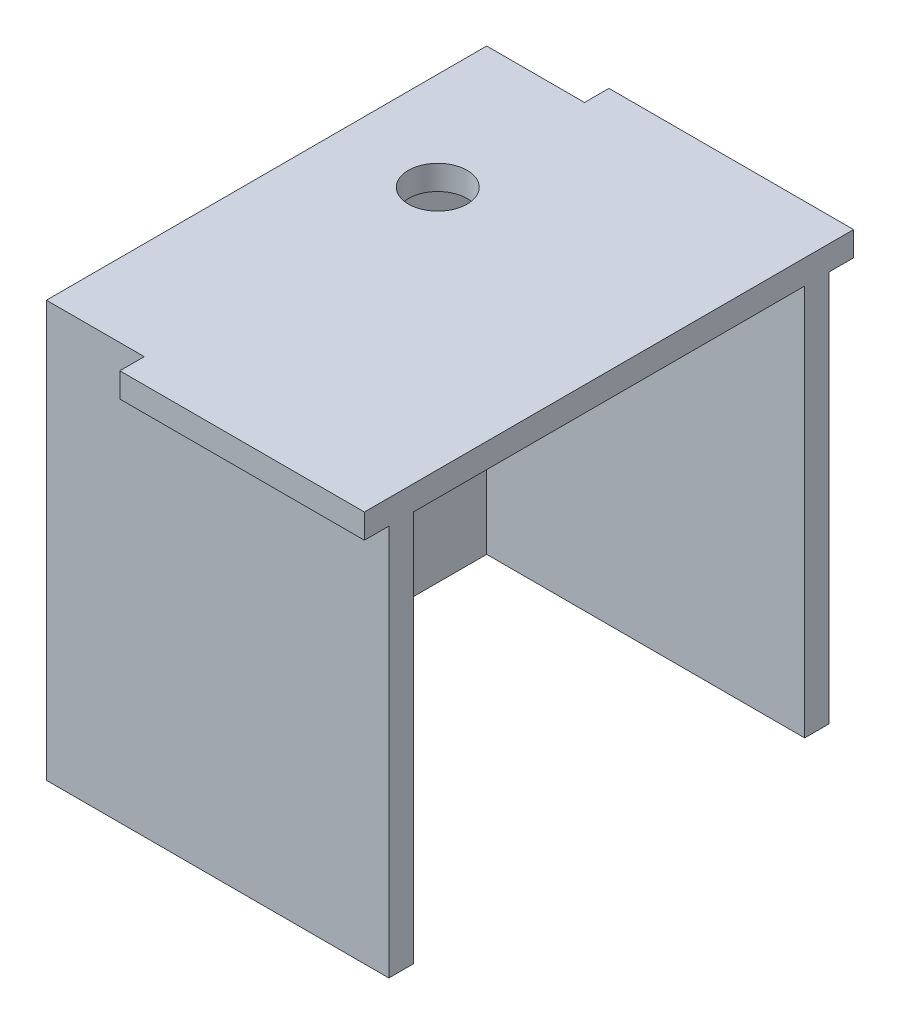
ISO-10303-21;
HEADER;
FILE_DESCRIPTION(('STEP AP214'),'2;1');
FILE_NAME('part.step','',(''),(''),'','','');
FILE_SCHEMA(('AUTOMOTIVE_DESIGN { 1 0 10303 214 1 1 1 1 }'));
ENDSEC;
DATA;
#1=APPLICATION_CONTEXT('core data for automotive mechanical design processes');
#2=APPLICATION_PROTOCOL_DEFINITION('international standard','automotive_design',2000,#1);
#3=PRODUCT_CONTEXT('',#1,'mechanical');
#4=PRODUCT('Part','Part','',(#3));
#5=PRODUCT_RELATED_PRODUCT_CATEGORY('part','',(#4));
#6=PRODUCT_DEFINITION_FORMATION('','',#4);
#7=PRODUCT_DEFINITION_CONTEXT('part definition',#1,'design');
#8=PRODUCT_DEFINITION('design','',#6,#7);
#9=PRODUCT_DEFINITION_SHAPE('','',#8);
#10=(LENGTH_UNIT() NAMED_UNIT(*) SI_UNIT(.MILLI.,.METRE.));
#11=(NAMED_UNIT(*) PLANE_ANGLE_UNIT() SI_UNIT($,.RADIAN.));
#12=(NAMED_UNIT(*) SI_UNIT($,.STERADIAN.) SOLID_ANGLE_UNIT());
#13=UNCERTAINTY_MEASURE_WITH_UNIT(LENGTH_MEASURE(1.E-05),#10,'distance_accuracy_value','');
#14=(GEOMETRIC_REPRESENTATION_CONTEXT(3) GLOBAL_UNCERTAINTY_ASSIGNED_CONTEXT((#13)) GLOBAL_UNIT_ASSIGNED_CONTEXT((#10,
#11,#12)) REPRESENTATION_CONTEXT('',''));
#15=CARTESIAN_POINT('',(0.,0.,0.));
#16=DIRECTION('',(0.,0.,1.));
#17=DIRECTION('',(1.,0.,0.));
#18=AXIS2_PLACEMENT_3D('',#15,#16,#17);
#19=CARTESIAN_POINT('',(-65.,0.,100.));
#20=DIRECTION('',(-1.,0.,0.));
#21=DIRECTION('',(0.,-1.,0.));
#22=AXIS2_PLACEMENT_3D('',#19,#20,#21);
#23=PLANE('',#22);
#24=CARTESIAN_POINT('',(-65.,-10.,50.));
#25=DIRECTION('',(1.,0.,0.));
#26=DIRECTION('',(0.,0.,-1.));
#27=AXIS2_PLACEMENT_3D('',#24,#25,#26);
#28=CIRCLE('',#27,1.5);
#29=CARTESIAN_POINT('',(-65.,-10.,48.5));
#30=VERTEX_POINT('',#29);
#31=EDGE_CURVE('E216',#30,#30,#28,.T.);
#32=ORIENTED_EDGE('',*,*,#31,.F.);
#33=EDGE_LOOP('',(#32));
#34=FACE_BOUND('',#33,.T.);
#35=CARTESIAN_POINT('',(-65.,-60.45,50.));
#36=DIRECTION('',(1.,0.,0.));
#37=DIRECTION('',(0.,0.,-1.));
#38=AXIS2_PLACEMENT_3D('',#35,#36,#37);
#39=CIRCLE('',#38,1.5);
#40=CARTESIAN_POINT('',(-65.,-60.45,48.5));
#41=VERTEX_POINT('',#40);
#42=EDGE_CURVE('E322',#41,#41,#39,.T.);
#43=ORIENTED_EDGE('',*,*,#42,.F.);
#44=EDGE_LOOP('',(#43));
#45=FACE_BOUND('',#44,.T.);
#46=DIRECTION('',(0.,1.,0.));
#47=VECTOR('',#46,1.);
#48=CARTESIAN_POINT('',(-65.,-56.275,75.));
#49=LINE('',#48,#47);
#50=CARTESIAN_POINT('',(-65.,-56.275,75.));
#51=VERTEX_POINT('',#50);
#52=CARTESIAN_POINT('',(-65.,-14.175,75.));
#53=VERTEX_POINT('',#52);
#54=EDGE_CURVE('E299',#51,#53,#49,.T.);
#55=ORIENTED_EDGE('',*,*,#54,.T.);
#56=DIRECTION('',(0.,0.,1.));
#57=VECTOR('',#56,1.);
#58=CARTESIAN_POINT('',(-65.,-14.175,95.));
#59=LINE('',#58,#57);
#60=CARTESIAN_POINT('',(-65.,-14.175,28.95));
#61=VERTEX_POINT('',#60);
#62=EDGE_CURVE('E311',#61,#53,#59,.T.);
#63=ORIENTED_EDGE('',*,*,#62,.F.);
#64=DIRECTION('',(0.,1.,0.));
#65=VECTOR('',#64,1.);
#66=CARTESIAN_POINT('',(-65.,-14.175,28.95));
#67=LINE('',#66,#65);
#68=CARTESIAN_POINT('',(-65.,-56.275,28.95));
#69=VERTEX_POINT('',#68);
#70=EDGE_CURVE('E308',#69,#61,#67,.T.);
#71=ORIENTED_EDGE('',*,*,#70,.F.);
#72=DIRECTION('',(0.,0.,-1.));
#73=VECTOR('',#72,1.);
#74=CARTESIAN_POINT('',(-65.,-56.275,95.));
#75=LINE('',#74,#73);
#76=EDGE_CURVE('E306',#51,#69,#75,.T.);
#77=ORIENTED_EDGE('',*,*,#76,.F.);
#78=EDGE_LOOP('',(#55,#63,#71,#77));
#79=FACE_BOUND('',#78,.T.);
#80=DIRECTION('',(0.,-1.,0.));
#81=VECTOR('',#80,1.);
#82=CARTESIAN_POINT('',(-65.,-80.,10.));
#83=LINE('',#82,#81);
#84=CARTESIAN_POINT('',(-65.,0.,9.99999999999999));
#85=VERTEX_POINT('',#84);
#86=CARTESIAN_POINT('',(-65.,-80.,10.));
#87=VERTEX_POINT('',#86);
#88=EDGE_CURVE('E168',#85,#87,#83,.T.);
#89=ORIENTED_EDGE('',*,*,#88,.F.);
#90=DIRECTION('',(0.,0.,-1.));
#91=VECTOR('',#90,1.);
#92=CARTESIAN_POINT('',(-65.,0.,100.));
#93=LINE('',#92,#91);
#94=CARTESIAN_POINT('',(-65.,0.,90.));
#95=VERTEX_POINT('',#94);
#96=EDGE_CURVE('E195',#95,#85,#93,.T.);
#97=ORIENTED_EDGE('',*,*,#96,.F.);
#98=DIRECTION('',(0.,1.,0.));
#99=VECTOR('',#98,1.);
#100=CARTESIAN_POINT('',(-65.,-80.,90.));
#101=LINE('',#100,#99);
#102=CARTESIAN_POINT('',(-65.,-80.,90.));
#103=VERTEX_POINT('',#102);
#104=EDGE_CURVE('E178',#103,#95,#101,.T.);
#105=ORIENTED_EDGE('',*,*,#104,.F.);
#106=DIRECTION('',(0.,0.,-1.));
#107=VECTOR('',#106,1.);
#108=CARTESIAN_POINT('',(-65.,-80.,100.));
#109=LINE('',#108,#107);
#110=EDGE_CURVE('E200',#103,#87,#109,.T.);
#111=ORIENTED_EDGE('',*,*,#110,.T.);
#112=EDGE_LOOP('',(#89,#97,#105,#111));
#113=FACE_BOUND('',#112,.T.);
#114=ADVANCED_FACE('F33',(#34,#45,#79,#113),#23,.F.);
#115=CARTESIAN_POINT('',(0.,0.,100.));
#116=DIRECTION('',(0.,1.,0.));
#117=DIRECTION('',(-1.,0.,0.));
#118=AXIS2_PLACEMENT_3D('',#115,#116,#117);
#119=PLANE('',#118);
#120=DIRECTION('',(-1.,0.,0.));
#121=VECTOR('',#120,1.);
#122=CARTESIAN_POINT('',(0.,0.,5.));
#123=LINE('',#122,#121);
#124=CARTESIAN_POINT('',(0.,0.,5.));
#125=VERTEX_POINT('',#124);
#126=CARTESIAN_POINT('',(-50.,0.,5.));
#127=VERTEX_POINT('',#126);
#128=EDGE_CURVE('E171',#125,#127,#123,.T.);
#129=ORIENTED_EDGE('',*,*,#128,.T.);
#130=DIRECTION('',(0.,0.,-1.));
#131=VECTOR('',#130,1.);
#132=CARTESIAN_POINT('',(-50.,0.,5.));
#133=LINE('',#132,#131);
#134=CARTESIAN_POINT('',(-50.,0.,0.));
#135=VERTEX_POINT('',#134);
#136=EDGE_CURVE('E228',#127,#135,#133,.T.);
#137=ORIENTED_EDGE('',*,*,#136,.T.);
#138=DIRECTION('',(1.,0.,0.));
#139=VECTOR('',#138,1.);
#140=CARTESIAN_POINT('',(0.,0.,0.));
#141=LINE('',#140,#139);
#142=CARTESIAN_POINT('',(0.,0.,0.));
#143=VERTEX_POINT('',#142);
#144=EDGE_CURVE('E183',#135,#143,#141,.T.);
#145=ORIENTED_EDGE('',*,*,#144,.T.);
#146=DIRECTION('',(0.,0.,-1.));
#147=VECTOR('',#146,1.);
#148=CARTESIAN_POINT('',(0.,0.,100.));
#149=LINE('',#148,#147);
#150=EDGE_CURVE('E162',#125,#143,#149,.T.);
#151=ORIENTED_EDGE('',*,*,#150,.F.);
#152=EDGE_LOOP('',(#129,#137,#145,#151));
#153=FACE_BOUND('',#152,.T.);
#154=ADVANCED_FACE('F181',(#153),#119,.F.);
#155=CARTESIAN_POINT('',(-50.,0.,35.));
#156=DIRECTION('',(0.,1.,0.));
#157=DIRECTION('',(-1.,0.,0.));
#158=AXIS2_PLACEMENT_3D('',#155,#156,#157);
#159=CIRCLE('',#158,6.);
#160=CARTESIAN_POINT('',(-56.,0.,35.));
#161=VERTEX_POINT('',#160);
#162=EDGE_CURVE('E293',#161,#161,#159,.T.);
#163=ORIENTED_EDGE('',*,*,#162,.T.);
#164=EDGE_LOOP('',(#163));
#165=FACE_BOUND('',#164,.T.);
#166=DIRECTION('',(-1.,0.,0.));
#167=VECTOR('',#166,1.);
#168=CARTESIAN_POINT('',(0.,0.,9.99999999999999));
#169=LINE('',#168,#167);
#170=CARTESIAN_POINT('',(0.,0.,9.99999999999999));
#171=VERTEX_POINT('',#170);
#172=EDGE_CURVE('E179',#171,#85,#169,.T.);
#173=ORIENTED_EDGE('',*,*,#172,.F.);
#174=CARTESIAN_POINT('',(0.,0.,90.));
#175=VERTEX_POINT('',#174);
#176=EDGE_CURVE('E185',#175,#171,#149,.T.);
#177=ORIENTED_EDGE('',*,*,#176,.F.);
#178=DIRECTION('',(-1.,0.,0.));
#179=VECTOR('',#178,1.);
#180=CARTESIAN_POINT('',(0.,0.,90.));
#181=LINE('',#180,#179);
#182=EDGE_CURVE('E280',#175,#95,#181,.T.);
#183=ORIENTED_EDGE('',*,*,#182,.T.);
#184=ORIENTED_EDGE('',*,*,#96,.T.);
#185=EDGE_LOOP('',(#173,#177,#183,#184));
#186=FACE_BOUND('',#185,.T.);
#187=ADVANCED_FACE('F363',(#165,#186),#119,.F.);
#188=DIRECTION('',(-1.,0.,0.));
#189=VECTOR('',#188,1.);
#190=CARTESIAN_POINT('',(0.,0.,95.));
#191=LINE('',#190,#189);
#192=CARTESIAN_POINT('',(0.,0.,95.));
#193=VERTEX_POINT('',#192);
#194=CARTESIAN_POINT('',(-50.,0.,95.));
#195=VERTEX_POINT('',#194);
#196=EDGE_CURVE('E277',#193,#195,#191,.T.);
#197=ORIENTED_EDGE('',*,*,#196,.F.);
#198=CARTESIAN_POINT('',(0.,0.,100.));
#199=VERTEX_POINT('',#198);
#200=EDGE_CURVE('E188',#199,#193,#149,.T.);
#201=ORIENTED_EDGE('',*,*,#200,.F.);
#202=DIRECTION('',(1.,0.,0.));
#203=VECTOR('',#202,1.);
#204=CARTESIAN_POINT('',(0.,0.,100.));
#205=LINE('',#204,#203);
#206=CARTESIAN_POINT('',(-50.,0.,100.));
#207=VERTEX_POINT('',#206);
#208=EDGE_CURVE('E186',#207,#199,#205,.T.);
#209=ORIENTED_EDGE('',*,*,#208,.F.);
#210=DIRECTION('',(0.,0.,1.));
#211=VECTOR('',#210,1.);
#212=CARTESIAN_POINT('',(-50.,0.,95.));
#213=LINE('',#212,#211);
#214=EDGE_CURVE('E239',#195,#207,#213,.T.);
#215=ORIENTED_EDGE('',*,*,#214,.F.);
#216=EDGE_LOOP('',(#197,#201,#209,#215));
#217=FACE_BOUND('',#216,.T.);
#218=ADVANCED_FACE('F276',(#217),#119,.F.);
#219=CARTESIAN_POINT('',(0.,5.,100.));
#220=DIRECTION('',(0.,-1.,0.));
#221=DIRECTION('',(1.,0.,0.));
#222=AXIS2_PLACEMENT_3D('',#219,#220,#221);
#223=PLANE('',#222);
#224=CARTESIAN_POINT('',(-50.,5.,35.));
#225=DIRECTION('',(0.,1.,0.));
#226=DIRECTION('',(-1.,0.,0.));
#227=AXIS2_PLACEMENT_3D('',#224,#225,#226);
#228=CIRCLE('',#227,6.);
#229=CARTESIAN_POINT('',(-56.,5.,35.));
#230=VERTEX_POINT('',#229);
#231=EDGE_CURVE('E292',#230,#230,#228,.T.);
#232=ORIENTED_EDGE('',*,*,#231,.F.);
#233=EDGE_LOOP('',(#232));
#234=FACE_BOUND('',#233,.T.);
#235=DIRECTION('',(1.,0.,0.));
#236=VECTOR('',#235,1.);
#237=CARTESIAN_POINT('',(-65.,4.99999999999999,5.));
#238=LINE('',#237,#236);
#239=CARTESIAN_POINT('',(-70.,4.99999999999998,5.));
#240=VERTEX_POINT('',#239);
#241=CARTESIAN_POINT('',(-50.,4.99999999999999,5.));
#242=VERTEX_POINT('',#241);
#243=EDGE_CURVE('E221',#240,#242,#238,.T.);
#244=ORIENTED_EDGE('',*,*,#243,.F.);
#245=DIRECTION('',(0.,0.,1.));
#246=VECTOR('',#245,1.);
#247=CARTESIAN_POINT('',(-70.,4.99999999999998,0.));
#248=LINE('',#247,#246);
#249=CARTESIAN_POINT('',(-70.,4.99999999999998,95.));
#250=VERTEX_POINT('',#249);
#251=EDGE_CURVE('E290',#240,#250,#248,.T.);
#252=ORIENTED_EDGE('',*,*,#251,.T.);
#253=DIRECTION('',(-1.,0.,0.));
#254=VECTOR('',#253,1.);
#255=CARTESIAN_POINT('',(-65.,4.99999999999999,95.));
#256=LINE('',#255,#254);
#257=CARTESIAN_POINT('',(-50.,4.99999999999999,95.));
#258=VERTEX_POINT('',#257);
#259=EDGE_CURVE('E236',#258,#250,#256,.T.);
#260=ORIENTED_EDGE('',*,*,#259,.F.);
#261=DIRECTION('',(0.,0.,1.));
#262=VECTOR('',#261,1.);
#263=CARTESIAN_POINT('',(-50.,4.99999999999999,95.));
#264=LINE('',#263,#262);
#265=CARTESIAN_POINT('',(-50.,4.99999999999999,100.));
#266=VERTEX_POINT('',#265);
#267=EDGE_CURVE('E241',#258,#266,#264,.T.);
#268=ORIENTED_EDGE('',*,*,#267,.T.);
#269=DIRECTION('',(-1.,0.,0.));
#270=VECTOR('',#269,1.);
#271=CARTESIAN_POINT('',(0.,5.,100.));
#272=LINE('',#271,#270);
#273=CARTESIAN_POINT('',(0.,5.,100.));
#274=VERTEX_POINT('',#273);
#275=EDGE_CURVE('E190',#274,#266,#272,.T.);
#276=ORIENTED_EDGE('',*,*,#275,.F.);
#277=DIRECTION('',(0.,0.,-1.));
#278=VECTOR('',#277,1.);
#279=CARTESIAN_POINT('',(0.,5.,100.));
#280=LINE('',#279,#278);
#281=CARTESIAN_POINT('',(0.,5.,0.));
#282=VERTEX_POINT('',#281);
#283=EDGE_CURVE('E41',#274,#282,#280,.T.);
#284=ORIENTED_EDGE('',*,*,#283,.T.);
#285=DIRECTION('',(-1.,0.,0.));
#286=VECTOR('',#285,1.);
#287=CARTESIAN_POINT('',(0.,5.,0.));
#288=LINE('',#287,#286);
#289=CARTESIAN_POINT('',(-50.,4.99999999999999,0.));
#290=VERTEX_POINT('',#289);
#291=EDGE_CURVE('E260',#282,#290,#288,.T.);
#292=ORIENTED_EDGE('',*,*,#291,.T.);
#293=DIRECTION('',(0.,0.,-1.));
#294=VECTOR('',#293,1.);
#295=CARTESIAN_POINT('',(-50.,4.99999999999999,5.));
#296=LINE('',#295,#294);
#297=EDGE_CURVE('E231',#242,#290,#296,.T.);
#298=ORIENTED_EDGE('',*,*,#297,.F.);
#299=EDGE_LOOP('',(#244,#252,#260,#268,#276,#284,#292,#298));
#300=FACE_BOUND('',#299,.T.);
#301=ADVANCED_FACE('F265',(#234,#300),#223,.F.);
#302=CARTESIAN_POINT('',(-70.,0.,100.));
#303=DIRECTION('',(1.,0.,0.));
#304=DIRECTION('',(0.,1.,0.));
#305=AXIS2_PLACEMENT_3D('',#302,#303,#304);
#306=PLANE('',#305);
#307=DIRECTION('',(0.,0.,1.));
#308=VECTOR('',#307,1.);
#309=CARTESIAN_POINT('',(-70.,-14.175,100.));
#310=LINE('',#309,#308);
#311=CARTESIAN_POINT('',(-70.,-14.175,28.95));
#312=VERTEX_POINT('',#311);
#313=CARTESIAN_POINT('',(-70.,-14.175,75.));
#314=VERTEX_POINT('',#313);
#315=EDGE_CURVE('E320',#312,#314,#310,.T.);
#316=ORIENTED_EDGE('',*,*,#315,.T.);
#317=DIRECTION('',(0.,1.,0.));
#318=VECTOR('',#317,1.);
#319=CARTESIAN_POINT('',(-70.,-56.275,75.));
#320=LINE('',#319,#318);
#321=CARTESIAN_POINT('',(-70.,-56.275,75.));
#322=VERTEX_POINT('',#321);
#323=EDGE_CURVE('E303',#322,#314,#320,.T.);
#324=ORIENTED_EDGE('',*,*,#323,.F.);
#325=DIRECTION('',(0.,0.,-1.));
#326=VECTOR('',#325,1.);
#327=CARTESIAN_POINT('',(-70.,-56.275,100.));
#328=LINE('',#327,#326);
#329=CARTESIAN_POINT('',(-70.,-56.275,28.95));
#330=VERTEX_POINT('',#329);
#331=EDGE_CURVE('E316',#322,#330,#328,.T.);
#332=ORIENTED_EDGE('',*,*,#331,.T.);
#333=DIRECTION('',(0.,1.,0.));
#334=VECTOR('',#333,1.);
#335=CARTESIAN_POINT('',(-70.,0.,28.95));
#336=LINE('',#335,#334);
#337=EDGE_CURVE('E11',#330,#312,#336,.T.);
#338=ORIENTED_EDGE('',*,*,#337,.T.);
#339=EDGE_LOOP('',(#316,#324,#332,#338));
#340=FACE_BOUND('',#339,.T.);
#341=CARTESIAN_POINT('',(-70.,-10.,50.));
#342=DIRECTION('',(1.,0.,0.));
#343=DIRECTION('',(0.,1.,0.));
#344=AXIS2_PLACEMENT_3D('',#341,#342,#343);
#345=CIRCLE('',#344,1.5);
#346=CARTESIAN_POINT('',(-70.,-8.50000000000001,50.));
#347=VERTEX_POINT('',#346);
#348=EDGE_CURVE('E215',#347,#347,#345,.T.);
#349=ORIENTED_EDGE('',*,*,#348,.T.);
#350=EDGE_LOOP('',(#349));
#351=FACE_BOUND('',#350,.T.);
#352=CARTESIAN_POINT('',(-70.,-60.45,50.));
#353=DIRECTION('',(1.,0.,0.));
#354=DIRECTION('',(0.,1.,0.));
#355=AXIS2_PLACEMENT_3D('',#352,#353,#354);
#356=CIRCLE('',#355,1.5);
#357=CARTESIAN_POINT('',(-70.,-58.95,50.));
#358=VERTEX_POINT('',#357);
#359=EDGE_CURVE('E213',#358,#358,#356,.T.);
#360=ORIENTED_EDGE('',*,*,#359,.T.);
#361=EDGE_LOOP('',(#360));
#362=FACE_BOUND('',#361,.T.);
#363=ORIENTED_EDGE('',*,*,#251,.F.);
#364=DIRECTION('',(0.,1.,0.));
#365=VECTOR('',#364,1.);
#366=CARTESIAN_POINT('',(-70.,0.,5.));
#367=LINE('',#366,#365);
#368=CARTESIAN_POINT('',(-70.,-80.,5.));
#369=VERTEX_POINT('',#368);
#370=EDGE_CURVE('E247',#369,#240,#367,.T.);
#371=ORIENTED_EDGE('',*,*,#370,.F.);
#372=DIRECTION('',(0.,0.,-1.));
#373=VECTOR('',#372,1.);
#374=CARTESIAN_POINT('',(-70.,-80.,100.));
#375=LINE('',#374,#373);
#376=CARTESIAN_POINT('',(-70.,-80.,95.));
#377=VERTEX_POINT('',#376);
#378=EDGE_CURVE('E206',#377,#369,#375,.T.);
#379=ORIENTED_EDGE('',*,*,#378,.F.);
#380=DIRECTION('',(0.,-1.,0.));
#381=VECTOR('',#380,1.);
#382=CARTESIAN_POINT('',(-70.,0.,95.));
#383=LINE('',#382,#381);
#384=EDGE_CURVE('E249',#250,#377,#383,.T.);
#385=ORIENTED_EDGE('',*,*,#384,.F.);
#386=EDGE_LOOP('',(#363,#371,#379,#385));
#387=FACE_BOUND('',#386,.T.);
#388=ADVANCED_FACE('F369',(#340,#351,#362,#387),#306,.F.);
#389=CARTESIAN_POINT('',(-75.,-14.175,95.));
#390=DIRECTION('',(0.,1.,0.));
#391=DIRECTION('',(0.,0.,1.));
#392=AXIS2_PLACEMENT_3D('',#389,#390,#391);
#393=PLANE('',#392);
#394=DIRECTION('',(1.,0.,0.));
#395=VECTOR('',#394,1.);
#396=CARTESIAN_POINT('',(-65.,-14.175,75.));
#397=LINE('',#396,#395);
#398=EDGE_CURVE('E48',#314,#53,#397,.T.);
#399=ORIENTED_EDGE('',*,*,#398,.F.);
#400=ORIENTED_EDGE('',*,*,#315,.F.);
#401=DIRECTION('',(1.,0.,0.));
#402=VECTOR('',#401,1.);
#403=CARTESIAN_POINT('',(-75.,-14.175,28.95));
#404=LINE('',#403,#402);
#405=EDGE_CURVE('E314',#312,#61,#404,.T.);
#406=ORIENTED_EDGE('',*,*,#405,.T.);
#407=ORIENTED_EDGE('',*,*,#62,.T.);
#408=EDGE_LOOP('',(#399,#400,#406,#407));
#409=FACE_BOUND('',#408,.T.);
#410=ADVANCED_FACE('F399',(#409),#393,.F.);
#411=CARTESIAN_POINT('',(-75.,-56.275,95.));
#412=DIRECTION('',(0.,-1.,0.));
#413=DIRECTION('',(0.,0.,-1.));
#414=AXIS2_PLACEMENT_3D('',#411,#412,#413);
#415=PLANE('',#414);
#416=DIRECTION('',(1.,0.,0.));
#417=VECTOR('',#416,1.);
#418=CARTESIAN_POINT('',(-65.,-56.275,75.));
#419=LINE('',#418,#417);
#420=EDGE_CURVE('E56',#322,#51,#419,.T.);
#421=ORIENTED_EDGE('',*,*,#420,.T.);
#422=ORIENTED_EDGE('',*,*,#76,.T.);
#423=DIRECTION('',(1.,0.,0.));
#424=VECTOR('',#423,1.);
#425=CARTESIAN_POINT('',(-75.,-56.275,28.95));
#426=LINE('',#425,#424);
#427=EDGE_CURVE('E313',#330,#69,#426,.T.);
#428=ORIENTED_EDGE('',*,*,#427,.F.);
#429=ORIENTED_EDGE('',*,*,#331,.F.);
#430=EDGE_LOOP('',(#421,#422,#428,#429));
#431=FACE_BOUND('',#430,.T.);
#432=ADVANCED_FACE('F397',(#431),#415,.F.);
#433=CARTESIAN_POINT('',(-65.,-80.,100.));
#434=DIRECTION('',(0.,1.,0.));
#435=DIRECTION('',(0.,0.,1.));
#436=AXIS2_PLACEMENT_3D('',#433,#434,#435);
#437=PLANE('',#436);
#438=DIRECTION('',(-1.,0.,0.));
#439=VECTOR('',#438,1.);
#440=CARTESIAN_POINT('',(-65.,-80.,5.));
#441=LINE('',#440,#439);
#442=CARTESIAN_POINT('',(0.,-80.,5.));
#443=VERTEX_POINT('',#442);
#444=EDGE_CURVE('E244',#443,#369,#441,.T.);
#445=ORIENTED_EDGE('',*,*,#444,.F.);
#446=DIRECTION('',(0.,0.,-1.));
#447=VECTOR('',#446,1.);
#448=CARTESIAN_POINT('',(0.,-80.,5.));
#449=LINE('',#448,#447);
#450=CARTESIAN_POINT('',(0.,-80.,10.));
#451=VERTEX_POINT('',#450);
#452=EDGE_CURVE('E165',#451,#443,#449,.T.);
#453=ORIENTED_EDGE('',*,*,#452,.F.);
#454=DIRECTION('',(-1.,0.,0.));
#455=VECTOR('',#454,1.);
#456=CARTESIAN_POINT('',(0.,-80.,10.));
#457=LINE('',#456,#455);
#458=EDGE_CURVE('E348',#451,#87,#457,.T.);
#459=ORIENTED_EDGE('',*,*,#458,.T.);
#460=ORIENTED_EDGE('',*,*,#110,.F.);
#461=DIRECTION('',(-1.,0.,0.));
#462=VECTOR('',#461,1.);
#463=CARTESIAN_POINT('',(0.,-80.,90.));
#464=LINE('',#463,#462);
#465=CARTESIAN_POINT('',(0.,-80.,90.));
#466=VERTEX_POINT('',#465);
#467=EDGE_CURVE('E283',#466,#103,#464,.T.);
#468=ORIENTED_EDGE('',*,*,#467,.F.);
#469=DIRECTION('',(0.,0.,-1.));
#470=VECTOR('',#469,1.);
#471=CARTESIAN_POINT('',(0.,-80.,95.));
#472=LINE('',#471,#470);
#473=CARTESIAN_POINT('',(0.,-80.,95.));
#474=VERTEX_POINT('',#473);
#475=EDGE_CURVE('E285',#474,#466,#472,.T.);
#476=ORIENTED_EDGE('',*,*,#475,.F.);
#477=DIRECTION('',(1.,0.,0.));
#478=VECTOR('',#477,1.);
#479=CARTESIAN_POINT('',(-65.,-80.,95.));
#480=LINE('',#479,#478);
#481=EDGE_CURVE('E251',#377,#474,#480,.T.);
#482=ORIENTED_EDGE('',*,*,#481,.F.);
#483=ORIENTED_EDGE('',*,*,#378,.T.);
#484=EDGE_LOOP('',(#445,#453,#459,#460,#468,#476,#482,#483));
#485=FACE_BOUND('',#484,.T.);
#486=ADVANCED_FACE('F359',(#485),#437,.F.);
#487=CARTESIAN_POINT('',(0.,0.,100.));
#488=DIRECTION('',(-1.,0.,0.));
#489=DIRECTION('',(0.,0.,1.));
#490=AXIS2_PLACEMENT_3D('',#487,#488,#489);
#491=PLANE('',#490);
#492=DIRECTION('',(0.,1.,0.));
#493=VECTOR('',#492,1.);
#494=CARTESIAN_POINT('',(0.,0.,0.));
#495=LINE('',#494,#493);
#496=EDGE_CURVE('E253',#143,#282,#495,.T.);
#497=ORIENTED_EDGE('',*,*,#496,.T.);
#498=ORIENTED_EDGE('',*,*,#283,.F.);
#499=DIRECTION('',(0.,1.,0.));
#500=VECTOR('',#499,1.);
#501=CARTESIAN_POINT('',(0.,0.,100.));
#502=LINE('',#501,#500);
#503=EDGE_CURVE('E254',#199,#274,#502,.T.);
#504=ORIENTED_EDGE('',*,*,#503,.F.);
#505=ORIENTED_EDGE('',*,*,#200,.T.);
#506=DIRECTION('',(0.,-1.,0.));
#507=VECTOR('',#506,1.);
#508=CARTESIAN_POINT('',(0.,-80.,95.));
#509=LINE('',#508,#507);
#510=EDGE_CURVE('E351',#193,#474,#509,.T.);
#511=ORIENTED_EDGE('',*,*,#510,.T.);
#512=ORIENTED_EDGE('',*,*,#475,.T.);
#513=DIRECTION('',(0.,1.,0.));
#514=VECTOR('',#513,1.);
#515=CARTESIAN_POINT('',(0.,-80.,90.));
#516=LINE('',#515,#514);
#517=EDGE_CURVE('E281',#466,#175,#516,.T.);
#518=ORIENTED_EDGE('',*,*,#517,.T.);
#519=ORIENTED_EDGE('',*,*,#176,.T.);
#520=DIRECTION('',(0.,-1.,0.));
#521=VECTOR('',#520,1.);
#522=CARTESIAN_POINT('',(0.,-80.,10.));
#523=LINE('',#522,#521);
#524=EDGE_CURVE('E167',#171,#451,#523,.T.);
#525=ORIENTED_EDGE('',*,*,#524,.T.);
#526=ORIENTED_EDGE('',*,*,#452,.T.);
#527=DIRECTION('',(0.,1.,0.));
#528=VECTOR('',#527,1.);
#529=CARTESIAN_POINT('',(0.,-80.,5.));
#530=LINE('',#529,#528);
#531=EDGE_CURVE('E158',#443,#125,#530,.T.);
#532=ORIENTED_EDGE('',*,*,#531,.T.);
#533=ORIENTED_EDGE('',*,*,#150,.T.);
#534=EDGE_LOOP('',(#497,#498,#504,#505,#511,#512,#518,#519,#525,#526,#532,#533));
#535=FACE_BOUND('',#534,.T.);
#536=ADVANCED_FACE('F35',(#535),#491,.F.);
#537=CARTESIAN_POINT('',(0.,0.,100.));
#538=DIRECTION('',(0.,0.,1.));
#539=DIRECTION('',(1.,0.,0.));
#540=AXIS2_PLACEMENT_3D('',#537,#538,#539);
#541=PLANE('',#540);
#542=DIRECTION('',(0.,1.,0.));
#543=VECTOR('',#542,1.);
#544=CARTESIAN_POINT('',(-50.,4.99999999999999,100.));
#545=LINE('',#544,#543);
#546=EDGE_CURVE('E230',#207,#266,#545,.T.);
#547=ORIENTED_EDGE('',*,*,#546,.F.);
#548=ORIENTED_EDGE('',*,*,#208,.T.);
#549=ORIENTED_EDGE('',*,*,#503,.T.);
#550=ORIENTED_EDGE('',*,*,#275,.T.);
#551=EDGE_LOOP('',(#547,#548,#549,#550));
#552=FACE_BOUND('',#551,.T.);
#553=ADVANCED_FACE('F271',(#552),#541,.T.);
#554=CARTESIAN_POINT('',(0.,0.,0.));
#555=DIRECTION('',(0.,0.,1.));
#556=DIRECTION('',(1.,0.,0.));
#557=AXIS2_PLACEMENT_3D('',#554,#555,#556);
#558=PLANE('',#557);
#559=ORIENTED_EDGE('',*,*,#144,.F.);
#560=DIRECTION('',(0.,-1.,0.));
#561=VECTOR('',#560,1.);
#562=CARTESIAN_POINT('',(-50.,4.99999999999999,0.));
#563=LINE('',#562,#561);
#564=EDGE_CURVE('E218',#290,#135,#563,.T.);
#565=ORIENTED_EDGE('',*,*,#564,.F.);
#566=ORIENTED_EDGE('',*,*,#291,.F.);
#567=ORIENTED_EDGE('',*,*,#496,.F.);
#568=EDGE_LOOP('',(#559,#565,#566,#567));
#569=FACE_BOUND('',#568,.T.);
#570=ADVANCED_FACE('F268',(#569),#558,.F.);
#571=CARTESIAN_POINT('',(0.,0.,95.));
#572=DIRECTION('',(0.,0.,-1.));
#573=DIRECTION('',(-1.,0.,0.));
#574=AXIS2_PLACEMENT_3D('',#571,#572,#573);
#575=PLANE('',#574);
#576=ORIENTED_EDGE('',*,*,#196,.T.);
#577=DIRECTION('',(0.,1.,0.));
#578=VECTOR('',#577,1.);
#579=CARTESIAN_POINT('',(-50.,4.99999999999999,95.));
#580=LINE('',#579,#578);
#581=EDGE_CURVE('E233',#195,#258,#580,.T.);
#582=ORIENTED_EDGE('',*,*,#581,.T.);
#583=ORIENTED_EDGE('',*,*,#259,.T.);
#584=ORIENTED_EDGE('',*,*,#384,.T.);
#585=ORIENTED_EDGE('',*,*,#481,.T.);
#586=ORIENTED_EDGE('',*,*,#510,.F.);
#587=EDGE_LOOP('',(#576,#582,#583,#584,#585,#586));
#588=FACE_BOUND('',#587,.T.);
#589=ADVANCED_FACE('F372',(#588),#575,.F.);
#590=CARTESIAN_POINT('',(0.,0.,5.));
#591=DIRECTION('',(0.,0.,-1.));
#592=DIRECTION('',(-1.,0.,0.));
#593=AXIS2_PLACEMENT_3D('',#590,#591,#592);
#594=PLANE('',#593);
#595=DIRECTION('',(0.,-1.,0.));
#596=VECTOR('',#595,1.);
#597=CARTESIAN_POINT('',(-50.,4.99999999999999,5.));
#598=LINE('',#597,#596);
#599=EDGE_CURVE('E174',#242,#127,#598,.T.);
#600=ORIENTED_EDGE('',*,*,#599,.T.);
#601=ORIENTED_EDGE('',*,*,#128,.F.);
#602=ORIENTED_EDGE('',*,*,#531,.F.);
#603=ORIENTED_EDGE('',*,*,#444,.T.);
#604=ORIENTED_EDGE('',*,*,#370,.T.);
#605=ORIENTED_EDGE('',*,*,#243,.T.);
#606=EDGE_LOOP('',(#600,#601,#602,#603,#604,#605));
#607=FACE_BOUND('',#606,.T.);
#608=ADVANCED_FACE('F172',(#607),#594,.T.);
#609=CARTESIAN_POINT('',(-50.,4.99999999999999,95.));
#610=DIRECTION('',(1.,0.,0.));
#611=DIRECTION('',(0.,0.,-1.));
#612=AXIS2_PLACEMENT_3D('',#609,#610,#611);
#613=PLANE('',#612);
#614=ORIENTED_EDGE('',*,*,#546,.T.);
#615=ORIENTED_EDGE('',*,*,#267,.F.);
#616=ORIENTED_EDGE('',*,*,#581,.F.);
#617=ORIENTED_EDGE('',*,*,#214,.T.);
#618=EDGE_LOOP('',(#614,#615,#616,#617));
#619=FACE_BOUND('',#618,.T.);
#620=ADVANCED_FACE('F374',(#619),#613,.F.);
#621=CARTESIAN_POINT('',(-50.,4.99999999999999,5.));
#622=DIRECTION('',(1.,0.,0.));
#623=DIRECTION('',(0.,0.,-1.));
#624=AXIS2_PLACEMENT_3D('',#621,#622,#623);
#625=PLANE('',#624);
#626=ORIENTED_EDGE('',*,*,#564,.T.);
#627=ORIENTED_EDGE('',*,*,#136,.F.);
#628=ORIENTED_EDGE('',*,*,#599,.F.);
#629=ORIENTED_EDGE('',*,*,#297,.T.);
#630=EDGE_LOOP('',(#626,#627,#628,#629));
#631=FACE_BOUND('',#630,.T.);
#632=ADVANCED_FACE('F376',(#631),#625,.F.);
#633=CARTESIAN_POINT('',(-75.,-60.45,50.));
#634=DIRECTION('',(1.,0.,0.));
#635=DIRECTION('',(0.,0.,-1.));
#636=AXIS2_PLACEMENT_3D('',#633,#634,#635);
#637=CYLINDRICAL_SURFACE('',#636,1.5);
#638=ORIENTED_EDGE('',*,*,#42,.T.);
#639=EDGE_LOOP('',(#638));
#640=FACE_BOUND('',#639,.T.);
#641=ORIENTED_EDGE('',*,*,#359,.F.);
#642=EDGE_LOOP('',(#641));
#643=FACE_BOUND('',#642,.T.);
#644=ADVANCED_FACE('F328',(#640,#643),#637,.F.);
#645=CARTESIAN_POINT('',(-75.,-10.,50.));
#646=DIRECTION('',(1.,0.,0.));
#647=DIRECTION('',(0.,0.,-1.));
#648=AXIS2_PLACEMENT_3D('',#645,#646,#647);
#649=CYLINDRICAL_SURFACE('',#648,1.5);
#650=ORIENTED_EDGE('',*,*,#31,.T.);
#651=EDGE_LOOP('',(#650));
#652=FACE_BOUND('',#651,.T.);
#653=ORIENTED_EDGE('',*,*,#348,.F.);
#654=EDGE_LOOP('',(#653));
#655=FACE_BOUND('',#654,.T.);
#656=ADVANCED_FACE('F429',(#652,#655),#649,.F.);
#657=CARTESIAN_POINT('',(-75.,-14.175,28.95));
#658=DIRECTION('',(0.,0.,-1.));
#659=DIRECTION('',(-1.,0.,0.));
#660=AXIS2_PLACEMENT_3D('',#657,#658,#659);
#661=PLANE('',#660);
#662=ORIENTED_EDGE('',*,*,#427,.T.);
#663=ORIENTED_EDGE('',*,*,#70,.T.);
#664=ORIENTED_EDGE('',*,*,#405,.F.);
#665=ORIENTED_EDGE('',*,*,#337,.F.);
#666=EDGE_LOOP('',(#662,#663,#664,#665));
#667=FACE_BOUND('',#666,.T.);
#668=ADVANCED_FACE('F419',(#667),#661,.F.);
#669=CARTESIAN_POINT('',(-65.,-56.275,75.));
#670=DIRECTION('',(0.,0.,1.));
#671=DIRECTION('',(0.,-1.,0.));
#672=AXIS2_PLACEMENT_3D('',#669,#670,#671);
#673=PLANE('',#672);
#674=ORIENTED_EDGE('',*,*,#398,.T.);
#675=ORIENTED_EDGE('',*,*,#54,.F.);
#676=ORIENTED_EDGE('',*,*,#420,.F.);
#677=ORIENTED_EDGE('',*,*,#323,.T.);
#678=EDGE_LOOP('',(#674,#675,#676,#677));
#679=FACE_BOUND('',#678,.T.);
#680=ADVANCED_FACE('F411',(#679),#673,.F.);
#681=CARTESIAN_POINT('',(-50.,0.,35.));
#682=DIRECTION('',(0.,1.,0.));
#683=DIRECTION('',(-1.,0.,0.));
#684=AXIS2_PLACEMENT_3D('',#681,#682,#683);
#685=CYLINDRICAL_SURFACE('',#684,6.);
#686=ORIENTED_EDGE('',*,*,#162,.F.);
#687=EDGE_LOOP('',(#686));
#688=FACE_BOUND('',#687,.T.);
#689=ORIENTED_EDGE('',*,*,#231,.T.);
#690=EDGE_LOOP('',(#689));
#691=FACE_BOUND('',#690,.T.);
#692=ADVANCED_FACE('F409',(#688,#691),#685,.F.);
#693=CARTESIAN_POINT('',(0.,-80.,90.));
#694=DIRECTION('',(0.,0.,1.));
#695=DIRECTION('',(1.,0.,0.));
#696=AXIS2_PLACEMENT_3D('',#693,#694,#695);
#697=PLANE('',#696);
#698=ORIENTED_EDGE('',*,*,#104,.T.);
#699=ORIENTED_EDGE('',*,*,#182,.F.);
#700=ORIENTED_EDGE('',*,*,#517,.F.);
#701=ORIENTED_EDGE('',*,*,#467,.T.);
#702=EDGE_LOOP('',(#698,#699,#700,#701));
#703=FACE_BOUND('',#702,.T.);
#704=ADVANCED_FACE('F361',(#703),#697,.F.);
#705=CARTESIAN_POINT('',(0.,-80.,10.));
#706=DIRECTION('',(0.,0.,-1.));
#707=DIRECTION('',(0.,1.,0.));
#708=AXIS2_PLACEMENT_3D('',#705,#706,#707);
#709=PLANE('',#708);
#710=ORIENTED_EDGE('',*,*,#88,.T.);
#711=ORIENTED_EDGE('',*,*,#458,.F.);
#712=ORIENTED_EDGE('',*,*,#524,.F.);
#713=ORIENTED_EDGE('',*,*,#172,.T.);
#714=EDGE_LOOP('',(#710,#711,#712,#713));
#715=FACE_BOUND('',#714,.T.);
#716=ADVANCED_FACE('F364',(#715),#709,.F.);
#717=CLOSED_SHELL('',(#114,#154,#187,#218,#301,#388,#410,#432,#486,#536,#553,#570,#589,#608,
#620,#632,#644,#656,#668,#680,#692,#704,#716));
#718=MANIFOLD_SOLID_BREP('B2',#717);
#719=ADVANCED_BREP_SHAPE_REPRESENTATION('',(#18,#718),#14);
#720=SHAPE_DEFINITION_REPRESENTATION(#9,#719);
ENDSEC;
END-ISO-10303-21;
